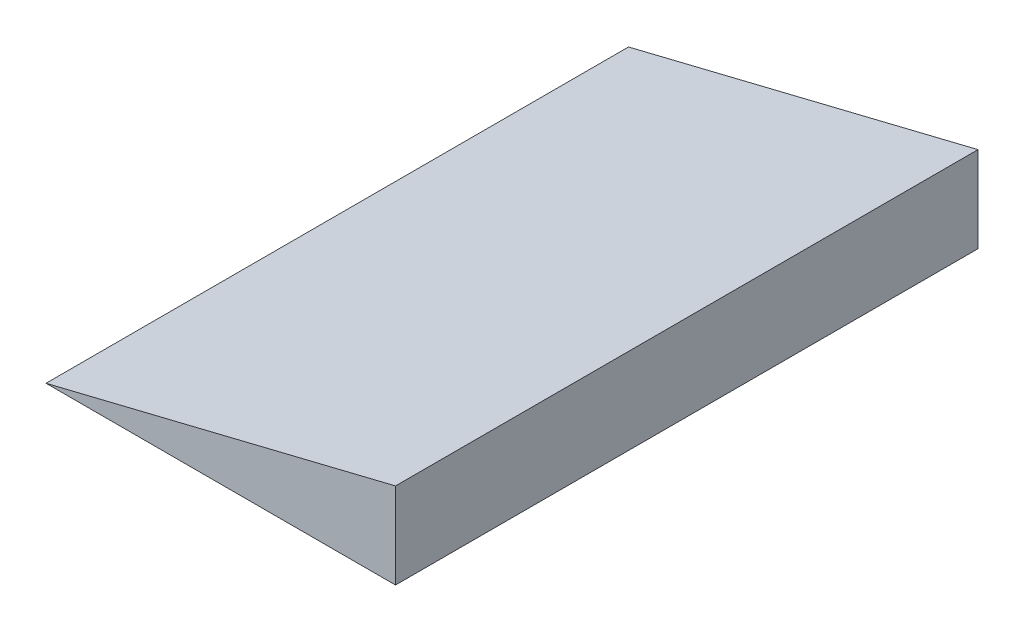
ISO-10303-21;
HEADER;
FILE_DESCRIPTION(('STEP AP214'),'2;1');
FILE_NAME('part.step','',(''),(''),'','','');
FILE_SCHEMA(('AUTOMOTIVE_DESIGN { 1 0 10303 214 1 1 1 1 }'));
ENDSEC;
DATA;
#1=APPLICATION_CONTEXT('core data for automotive mechanical design processes');
#2=APPLICATION_PROTOCOL_DEFINITION('international standard','automotive_design',2000,#1);
#3=PRODUCT_CONTEXT('',#1,'mechanical');
#4=PRODUCT('Part','Part','',(#3));
#5=PRODUCT_RELATED_PRODUCT_CATEGORY('part','',(#4));
#6=PRODUCT_DEFINITION_FORMATION('','',#4);
#7=PRODUCT_DEFINITION_CONTEXT('part definition',#1,'design');
#8=PRODUCT_DEFINITION('design','',#6,#7);
#9=PRODUCT_DEFINITION_SHAPE('','',#8);
#10=(LENGTH_UNIT() NAMED_UNIT(*) SI_UNIT(.MILLI.,.METRE.));
#11=(NAMED_UNIT(*) PLANE_ANGLE_UNIT() SI_UNIT($,.RADIAN.));
#12=(NAMED_UNIT(*) SI_UNIT($,.STERADIAN.) SOLID_ANGLE_UNIT());
#13=UNCERTAINTY_MEASURE_WITH_UNIT(LENGTH_MEASURE(1.E-05),#10,'distance_accuracy_value','');
#14=(GEOMETRIC_REPRESENTATION_CONTEXT(3) GLOBAL_UNCERTAINTY_ASSIGNED_CONTEXT((#13)) GLOBAL_UNIT_ASSIGNED_CONTEXT((#10,
#11,#12)) REPRESENTATION_CONTEXT('',''));
#15=CARTESIAN_POINT('',(0.,0.,0.));
#16=DIRECTION('',(0.,0.,1.));
#17=DIRECTION('',(1.,0.,0.));
#18=AXIS2_PLACEMENT_3D('',#15,#16,#17);
#19=CARTESIAN_POINT('',(30.,7.36870675394456,50.));
#20=DIRECTION('',(0.238533457578575,-0.971134279909638,0.));
#21=DIRECTION('',(0.971134279909638,0.238533457578575,0.));
#22=AXIS2_PLACEMENT_3D('',#19,#20,#21);
#23=PLANE('',#22);
#24=DIRECTION('',(-0.971134279909638,-0.238533457578575,0.));
#25=VECTOR('',#24,1.);
#26=CARTESIAN_POINT('',(30.,7.36870675394456,0.));
#27=LINE('',#26,#25);
#28=CARTESIAN_POINT('',(30.,7.36870675394456,0.));
#29=VERTEX_POINT('',#28);
#30=CARTESIAN_POINT('',(0.,0.,0.));
#31=VERTEX_POINT('',#30);
#32=EDGE_CURVE('E80',#29,#31,#27,.T.);
#33=ORIENTED_EDGE('',*,*,#32,.T.);
#34=DIRECTION('',(0.,0.,-1.));
#35=VECTOR('',#34,1.);
#36=CARTESIAN_POINT('',(0.,0.,50.));
#37=LINE('',#36,#35);
#38=CARTESIAN_POINT('',(0.,0.,50.));
#39=VERTEX_POINT('',#38);
#40=EDGE_CURVE('E11',#39,#31,#37,.T.);
#41=ORIENTED_EDGE('',*,*,#40,.F.);
#42=DIRECTION('',(-0.971134279909638,-0.238533457578575,0.));
#43=VECTOR('',#42,1.);
#44=CARTESIAN_POINT('',(30.,7.36870675394456,50.));
#45=LINE('',#44,#43);
#46=CARTESIAN_POINT('',(30.,7.36870675394456,50.));
#47=VERTEX_POINT('',#46);
#48=EDGE_CURVE('E73',#47,#39,#45,.T.);
#49=ORIENTED_EDGE('',*,*,#48,.F.);
#50=DIRECTION('',(0.,0.,-1.));
#51=VECTOR('',#50,1.);
#52=CARTESIAN_POINT('',(30.,7.36870675394456,50.));
#53=LINE('',#52,#51);
#54=EDGE_CURVE('E81',#47,#29,#53,.T.);
#55=ORIENTED_EDGE('',*,*,#54,.T.);
#56=EDGE_LOOP('',(#33,#41,#49,#55));
#57=FACE_BOUND('',#56,.T.);
#58=ADVANCED_FACE('F33',(#57),#23,.F.);
#59=CARTESIAN_POINT('',(0.,0.,50.));
#60=DIRECTION('',(0.,1.,0.));
#61=DIRECTION('',(0.,0.,1.));
#62=AXIS2_PLACEMENT_3D('',#59,#60,#61);
#63=PLANE('',#62);
#64=DIRECTION('',(1.,0.,0.));
#65=VECTOR('',#64,1.);
#66=CARTESIAN_POINT('',(0.,0.,0.));
#67=LINE('',#66,#65);
#68=CARTESIAN_POINT('',(30.,0.,0.));
#69=VERTEX_POINT('',#68);
#70=EDGE_CURVE('E61',#31,#69,#67,.T.);
#71=ORIENTED_EDGE('',*,*,#70,.T.);
#72=DIRECTION('',(0.,0.,-1.));
#73=VECTOR('',#72,1.);
#74=CARTESIAN_POINT('',(30.,0.,50.));
#75=LINE('',#74,#73);
#76=CARTESIAN_POINT('',(30.,0.,50.));
#77=VERTEX_POINT('',#76);
#78=EDGE_CURVE('E41',#77,#69,#75,.T.);
#79=ORIENTED_EDGE('',*,*,#78,.F.);
#80=DIRECTION('',(1.,0.,0.));
#81=VECTOR('',#80,1.);
#82=CARTESIAN_POINT('',(0.,0.,50.));
#83=LINE('',#82,#81);
#84=EDGE_CURVE('E69',#39,#77,#83,.T.);
#85=ORIENTED_EDGE('',*,*,#84,.F.);
#86=ORIENTED_EDGE('',*,*,#40,.T.);
#87=EDGE_LOOP('',(#71,#79,#85,#86));
#88=FACE_BOUND('',#87,.T.);
#89=ADVANCED_FACE('F70',(#88),#63,.F.);
#90=CARTESIAN_POINT('',(30.,0.,50.));
#91=DIRECTION('',(-1.,0.,0.));
#92=DIRECTION('',(0.,0.,1.));
#93=AXIS2_PLACEMENT_3D('',#90,#91,#92);
#94=PLANE('',#93);
#95=DIRECTION('',(0.,1.,0.));
#96=VECTOR('',#95,1.);
#97=CARTESIAN_POINT('',(30.,0.,0.));
#98=LINE('',#97,#96);
#99=EDGE_CURVE('E66',#69,#29,#98,.T.);
#100=ORIENTED_EDGE('',*,*,#99,.T.);
#101=ORIENTED_EDGE('',*,*,#54,.F.);
#102=DIRECTION('',(0.,1.,0.));
#103=VECTOR('',#102,1.);
#104=CARTESIAN_POINT('',(30.,0.,50.));
#105=LINE('',#104,#103);
#106=EDGE_CURVE('E49',#77,#47,#105,.T.);
#107=ORIENTED_EDGE('',*,*,#106,.F.);
#108=ORIENTED_EDGE('',*,*,#78,.T.);
#109=EDGE_LOOP('',(#100,#101,#107,#108));
#110=FACE_BOUND('',#109,.T.);
#111=ADVANCED_FACE('F88',(#110),#94,.F.);
#112=CARTESIAN_POINT('',(0.,0.,50.));
#113=DIRECTION('',(0.,0.,-1.));
#114=DIRECTION('',(-1.,0.,0.));
#115=AXIS2_PLACEMENT_3D('',#112,#113,#114);
#116=PLANE('',#115);
#117=ORIENTED_EDGE('',*,*,#48,.T.);
#118=ORIENTED_EDGE('',*,*,#84,.T.);
#119=ORIENTED_EDGE('',*,*,#106,.T.);
#120=EDGE_LOOP('',(#117,#118,#119));
#121=FACE_BOUND('',#120,.T.);
#122=ADVANCED_FACE('F76',(#121),#116,.F.);
#123=CARTESIAN_POINT('',(0.,0.,0.));
#124=DIRECTION('',(0.,0.,-1.));
#125=DIRECTION('',(-1.,0.,0.));
#126=AXIS2_PLACEMENT_3D('',#123,#124,#125);
#127=PLANE('',#126);
#128=ORIENTED_EDGE('',*,*,#32,.F.);
#129=ORIENTED_EDGE('',*,*,#99,.F.);
#130=ORIENTED_EDGE('',*,*,#70,.F.);
#131=EDGE_LOOP('',(#128,#129,#130));
#132=FACE_BOUND('',#131,.T.);
#133=ADVANCED_FACE('F89',(#132),#127,.T.);
#134=CLOSED_SHELL('',(#58,#89,#111,#122,#133));
#135=MANIFOLD_SOLID_BREP('B2',#134);
#136=ADVANCED_BREP_SHAPE_REPRESENTATION('',(#18,#135),#14);
#137=SHAPE_DEFINITION_REPRESENTATION(#9,#136);
ENDSEC;
END-ISO-10303-21;
